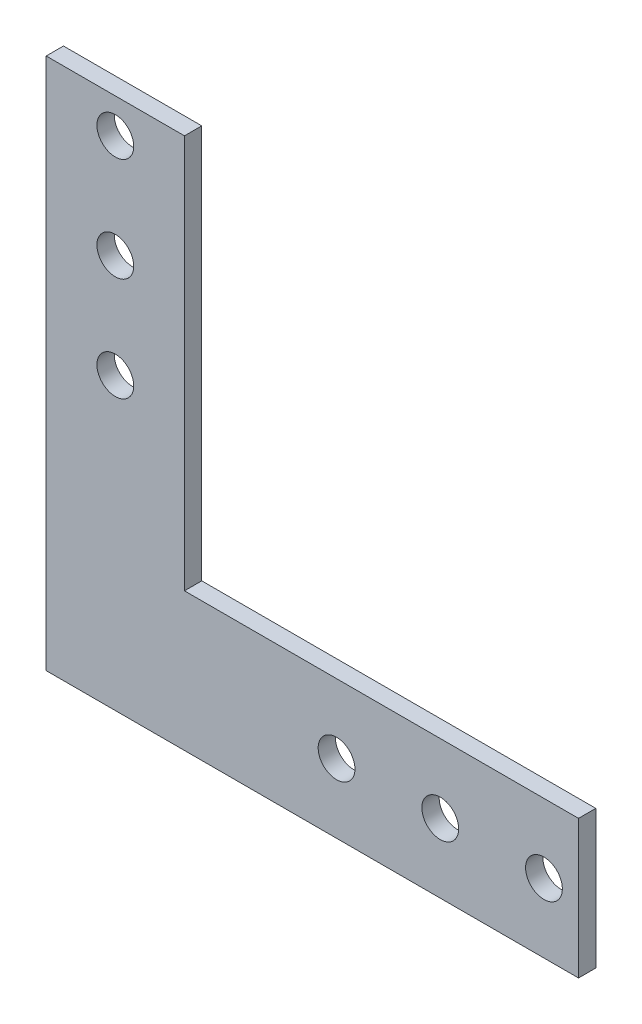
ISO-10303-21;
HEADER;
FILE_DESCRIPTION(('STEP AP214'),'2;1');
FILE_NAME('part.step','',(''),(''),'','','');
FILE_SCHEMA(('AUTOMOTIVE_DESIGN { 1 0 10303 214 1 1 1 1 }'));
ENDSEC;
DATA;
#1=APPLICATION_CONTEXT('core data for automotive mechanical design processes');
#2=APPLICATION_PROTOCOL_DEFINITION('international standard','automotive_design',2000,#1);
#3=PRODUCT_CONTEXT('',#1,'mechanical');
#4=PRODUCT('Part','Part','',(#3));
#5=PRODUCT_RELATED_PRODUCT_CATEGORY('part','',(#4));
#6=PRODUCT_DEFINITION_FORMATION('','',#4);
#7=PRODUCT_DEFINITION_CONTEXT('part definition',#1,'design');
#8=PRODUCT_DEFINITION('design','',#6,#7);
#9=PRODUCT_DEFINITION_SHAPE('','',#8);
#10=(LENGTH_UNIT() NAMED_UNIT(*) SI_UNIT(.MILLI.,.METRE.));
#11=(NAMED_UNIT(*) PLANE_ANGLE_UNIT() SI_UNIT($,.RADIAN.));
#12=(NAMED_UNIT(*) SI_UNIT($,.STERADIAN.) SOLID_ANGLE_UNIT());
#13=UNCERTAINTY_MEASURE_WITH_UNIT(LENGTH_MEASURE(1.E-05),#10,'distance_accuracy_value','');
#14=(GEOMETRIC_REPRESENTATION_CONTEXT(3) GLOBAL_UNCERTAINTY_ASSIGNED_CONTEXT((#13)) GLOBAL_UNIT_ASSIGNED_CONTEXT((#10,
#11,#12)) REPRESENTATION_CONTEXT('',''));
#15=CARTESIAN_POINT('',(0.,0.,0.));
#16=DIRECTION('',(0.,0.,1.));
#17=DIRECTION('',(1.,0.,0.));
#18=AXIS2_PLACEMENT_3D('',#15,#16,#17);
#19=CARTESIAN_POINT('',(0.,25.4,3.175));
#20=DIRECTION('',(0.,1.,0.));
#21=DIRECTION('',(-1.,0.,0.));
#22=AXIS2_PLACEMENT_3D('',#19,#20,#21);
#23=PLANE('',#22);
#24=DIRECTION('',(1.,0.,0.));
#25=VECTOR('',#24,1.);
#26=CARTESIAN_POINT('',(0.,25.4,0.));
#27=LINE('',#26,#25);
#28=CARTESIAN_POINT('',(25.4,25.4,0.));
#29=VERTEX_POINT('',#28);
#30=CARTESIAN_POINT('',(97.79,25.4,0.));
#31=VERTEX_POINT('',#30);
#32=EDGE_CURVE('E117',#29,#31,#27,.T.);
#33=ORIENTED_EDGE('',*,*,#32,.F.);
#34=DIRECTION('',(0.,0.,-1.));
#35=VECTOR('',#34,1.);
#36=CARTESIAN_POINT('',(25.4,25.4,3.175));
#37=LINE('',#36,#35);
#38=CARTESIAN_POINT('',(25.4,25.4,3.175));
#39=VERTEX_POINT('',#38);
#40=EDGE_CURVE('E11',#39,#29,#37,.T.);
#41=ORIENTED_EDGE('',*,*,#40,.F.);
#42=DIRECTION('',(1.,0.,0.));
#43=VECTOR('',#42,1.);
#44=CARTESIAN_POINT('',(0.,25.4,3.175));
#45=LINE('',#44,#43);
#46=CARTESIAN_POINT('',(97.79,25.4,3.175));
#47=VERTEX_POINT('',#46);
#48=EDGE_CURVE('E131',#39,#47,#45,.T.);
#49=ORIENTED_EDGE('',*,*,#48,.T.);
#50=DIRECTION('',(0.,0.,-1.));
#51=VECTOR('',#50,1.);
#52=CARTESIAN_POINT('',(97.79,25.4,3.175));
#53=LINE('',#52,#51);
#54=EDGE_CURVE('E79',#47,#31,#53,.T.);
#55=ORIENTED_EDGE('',*,*,#54,.T.);
#56=EDGE_LOOP('',(#33,#41,#49,#55));
#57=FACE_BOUND('',#56,.T.);
#58=ADVANCED_FACE('F35',(#57),#23,.T.);
#59=CARTESIAN_POINT('',(25.4,0.,3.175));
#60=DIRECTION('',(-1.,0.,0.));
#61=DIRECTION('',(0.,-1.,0.));
#62=AXIS2_PLACEMENT_3D('',#59,#60,#61);
#63=PLANE('',#62);
#64=DIRECTION('',(0.,1.,0.));
#65=VECTOR('',#64,1.);
#66=CARTESIAN_POINT('',(25.4,0.,0.));
#67=LINE('',#66,#65);
#68=CARTESIAN_POINT('',(25.4,97.79,0.));
#69=VERTEX_POINT('',#68);
#70=EDGE_CURVE('E120',#29,#69,#67,.T.);
#71=ORIENTED_EDGE('',*,*,#70,.T.);
#72=DIRECTION('',(0.,0.,-1.));
#73=VECTOR('',#72,1.);
#74=CARTESIAN_POINT('',(25.4,97.79,3.175));
#75=LINE('',#74,#73);
#76=CARTESIAN_POINT('',(25.4,97.79,3.175));
#77=VERTEX_POINT('',#76);
#78=EDGE_CURVE('E43',#77,#69,#75,.T.);
#79=ORIENTED_EDGE('',*,*,#78,.F.);
#80=DIRECTION('',(0.,1.,0.));
#81=VECTOR('',#80,1.);
#82=CARTESIAN_POINT('',(25.4,0.,3.175));
#83=LINE('',#82,#81);
#84=EDGE_CURVE('E112',#39,#77,#83,.T.);
#85=ORIENTED_EDGE('',*,*,#84,.F.);
#86=ORIENTED_EDGE('',*,*,#40,.T.);
#87=EDGE_LOOP('',(#71,#79,#85,#86));
#88=FACE_BOUND('',#87,.T.);
#89=ADVANCED_FACE('F140',(#88),#63,.F.);
#90=CARTESIAN_POINT('',(0.,97.79,3.175));
#91=DIRECTION('',(0.,1.,0.));
#92=DIRECTION('',(0.,0.,1.));
#93=AXIS2_PLACEMENT_3D('',#90,#91,#92);
#94=PLANE('',#93);
#95=DIRECTION('',(1.,0.,0.));
#96=VECTOR('',#95,1.);
#97=CARTESIAN_POINT('',(0.,97.79,0.));
#98=LINE('',#97,#96);
#99=CARTESIAN_POINT('',(0.,97.79,0.));
#100=VERTEX_POINT('',#99);
#101=EDGE_CURVE('E124',#100,#69,#98,.T.);
#102=ORIENTED_EDGE('',*,*,#101,.F.);
#103=DIRECTION('',(0.,0.,-1.));
#104=VECTOR('',#103,1.);
#105=CARTESIAN_POINT('',(0.,97.79,3.175));
#106=LINE('',#105,#104);
#107=CARTESIAN_POINT('',(0.,97.79,3.175));
#108=VERTEX_POINT('',#107);
#109=EDGE_CURVE('E101',#108,#100,#106,.T.);
#110=ORIENTED_EDGE('',*,*,#109,.F.);
#111=DIRECTION('',(1.,0.,0.));
#112=VECTOR('',#111,1.);
#113=CARTESIAN_POINT('',(0.,97.79,3.175));
#114=LINE('',#113,#112);
#115=EDGE_CURVE('E110',#108,#77,#114,.T.);
#116=ORIENTED_EDGE('',*,*,#115,.T.);
#117=ORIENTED_EDGE('',*,*,#78,.T.);
#118=EDGE_LOOP('',(#102,#110,#116,#117));
#119=FACE_BOUND('',#118,.T.);
#120=ADVANCED_FACE('F137',(#119),#94,.T.);
#121=CARTESIAN_POINT('',(0.,0.,3.175));
#122=DIRECTION('',(-1.,0.,0.));
#123=DIRECTION('',(0.,0.,1.));
#124=AXIS2_PLACEMENT_3D('',#121,#122,#123);
#125=PLANE('',#124);
#126=DIRECTION('',(0.,1.,0.));
#127=VECTOR('',#126,1.);
#128=CARTESIAN_POINT('',(0.,0.,0.));
#129=LINE('',#128,#127);
#130=CARTESIAN_POINT('',(0.,0.,0.));
#131=VERTEX_POINT('',#130);
#132=EDGE_CURVE('E100',#131,#100,#129,.T.);
#133=ORIENTED_EDGE('',*,*,#132,.F.);
#134=DIRECTION('',(0.,0.,-1.));
#135=VECTOR('',#134,1.);
#136=CARTESIAN_POINT('',(0.,0.,3.175));
#137=LINE('',#136,#135);
#138=CARTESIAN_POINT('',(0.,0.,3.175));
#139=VERTEX_POINT('',#138);
#140=EDGE_CURVE('E94',#139,#131,#137,.T.);
#141=ORIENTED_EDGE('',*,*,#140,.F.);
#142=DIRECTION('',(0.,1.,0.));
#143=VECTOR('',#142,1.);
#144=CARTESIAN_POINT('',(0.,0.,3.175));
#145=LINE('',#144,#143);
#146=EDGE_CURVE('E98',#139,#108,#145,.T.);
#147=ORIENTED_EDGE('',*,*,#146,.T.);
#148=ORIENTED_EDGE('',*,*,#109,.T.);
#149=EDGE_LOOP('',(#133,#141,#147,#148));
#150=FACE_BOUND('',#149,.T.);
#151=ADVANCED_FACE('F96',(#150),#125,.T.);
#152=CARTESIAN_POINT('',(0.,0.,3.175));
#153=DIRECTION('',(0.,1.,0.));
#154=DIRECTION('',(0.,0.,1.));
#155=AXIS2_PLACEMENT_3D('',#152,#153,#154);
#156=PLANE('',#155);
#157=DIRECTION('',(1.,0.,0.));
#158=VECTOR('',#157,1.);
#159=CARTESIAN_POINT('',(0.,0.,0.));
#160=LINE('',#159,#158);
#161=CARTESIAN_POINT('',(97.79,0.,0.));
#162=VERTEX_POINT('',#161);
#163=EDGE_CURVE('E72',#131,#162,#160,.T.);
#164=ORIENTED_EDGE('',*,*,#163,.T.);
#165=DIRECTION('',(0.,0.,-1.));
#166=VECTOR('',#165,1.);
#167=CARTESIAN_POINT('',(97.79,0.,3.175));
#168=LINE('',#167,#166);
#169=CARTESIAN_POINT('',(97.79,0.,3.175));
#170=VERTEX_POINT('',#169);
#171=EDGE_CURVE('E102',#170,#162,#168,.T.);
#172=ORIENTED_EDGE('',*,*,#171,.F.);
#173=DIRECTION('',(1.,0.,0.));
#174=VECTOR('',#173,1.);
#175=CARTESIAN_POINT('',(0.,0.,3.175));
#176=LINE('',#175,#174);
#177=EDGE_CURVE('E104',#139,#170,#176,.T.);
#178=ORIENTED_EDGE('',*,*,#177,.F.);
#179=ORIENTED_EDGE('',*,*,#140,.T.);
#180=EDGE_LOOP('',(#164,#172,#178,#179));
#181=FACE_BOUND('',#180,.T.);
#182=ADVANCED_FACE('F105',(#181),#156,.F.);
#183=CARTESIAN_POINT('',(97.79,0.,3.175));
#184=DIRECTION('',(-1.,0.,0.));
#185=DIRECTION('',(0.,-1.,0.));
#186=AXIS2_PLACEMENT_3D('',#183,#184,#185);
#187=PLANE('',#186);
#188=DIRECTION('',(0.,1.,0.));
#189=VECTOR('',#188,1.);
#190=CARTESIAN_POINT('',(97.79,0.,0.));
#191=LINE('',#190,#189);
#192=EDGE_CURVE('E129',#162,#31,#191,.T.);
#193=ORIENTED_EDGE('',*,*,#192,.T.);
#194=ORIENTED_EDGE('',*,*,#54,.F.);
#195=DIRECTION('',(0.,1.,0.));
#196=VECTOR('',#195,1.);
#197=CARTESIAN_POINT('',(97.79,0.,3.175));
#198=LINE('',#197,#196);
#199=EDGE_CURVE('E51',#170,#47,#198,.T.);
#200=ORIENTED_EDGE('',*,*,#199,.F.);
#201=ORIENTED_EDGE('',*,*,#171,.T.);
#202=EDGE_LOOP('',(#193,#194,#200,#201));
#203=FACE_BOUND('',#202,.T.);
#204=ADVANCED_FACE('F145',(#203),#187,.F.);
#205=CARTESIAN_POINT('',(0.,0.,3.175));
#206=DIRECTION('',(0.,0.,1.));
#207=DIRECTION('',(1.,0.,0.));
#208=AXIS2_PLACEMENT_3D('',#205,#206,#207);
#209=PLANE('',#208);
#210=CARTESIAN_POINT('',(91.44,12.7,3.175));
#211=DIRECTION('',(0.,0.,1.));
#212=DIRECTION('',(1.,0.,0.));
#213=AXIS2_PLACEMENT_3D('',#210,#211,#212);
#214=CIRCLE('',#213,3.37819999999999);
#215=CARTESIAN_POINT('',(94.8182,12.7,3.175));
#216=VERTEX_POINT('',#215);
#217=EDGE_CURVE('E178',#216,#216,#214,.T.);
#218=ORIENTED_EDGE('',*,*,#217,.F.);
#219=EDGE_LOOP('',(#218));
#220=FACE_BOUND('',#219,.T.);
#221=CARTESIAN_POINT('',(12.7,91.44,3.175));
#222=DIRECTION('',(0.,0.,1.));
#223=DIRECTION('',(1.,0.,0.));
#224=AXIS2_PLACEMENT_3D('',#221,#222,#223);
#225=CIRCLE('',#224,3.3782);
#226=CARTESIAN_POINT('',(16.0782,91.44,3.175));
#227=VERTEX_POINT('',#226);
#228=EDGE_CURVE('E172',#227,#227,#225,.T.);
#229=ORIENTED_EDGE('',*,*,#228,.F.);
#230=EDGE_LOOP('',(#229));
#231=FACE_BOUND('',#230,.T.);
#232=CARTESIAN_POINT('',(12.7,72.39,3.175));
#233=DIRECTION('',(0.,0.,1.));
#234=DIRECTION('',(1.,0.,0.));
#235=AXIS2_PLACEMENT_3D('',#232,#233,#234);
#236=CIRCLE('',#235,3.3782);
#237=CARTESIAN_POINT('',(16.0782,72.39,3.175));
#238=VERTEX_POINT('',#237);
#239=EDGE_CURVE('E166',#238,#238,#236,.T.);
#240=ORIENTED_EDGE('',*,*,#239,.F.);
#241=EDGE_LOOP('',(#240));
#242=FACE_BOUND('',#241,.T.);
#243=CARTESIAN_POINT('',(12.7,53.34,3.175));
#244=DIRECTION('',(0.,0.,1.));
#245=DIRECTION('',(1.,0.,0.));
#246=AXIS2_PLACEMENT_3D('',#243,#244,#245);
#247=CIRCLE('',#246,3.3782);
#248=CARTESIAN_POINT('',(16.0782,53.34,3.175));
#249=VERTEX_POINT('',#248);
#250=EDGE_CURVE('E160',#249,#249,#247,.T.);
#251=ORIENTED_EDGE('',*,*,#250,.F.);
#252=EDGE_LOOP('',(#251));
#253=FACE_BOUND('',#252,.T.);
#254=CARTESIAN_POINT('',(72.39,12.7,3.175));
#255=DIRECTION('',(0.,0.,1.));
#256=DIRECTION('',(1.,0.,0.));
#257=AXIS2_PLACEMENT_3D('',#254,#255,#256);
#258=CIRCLE('',#257,3.37819999999999);
#259=CARTESIAN_POINT('',(75.7682,12.7,3.175));
#260=VERTEX_POINT('',#259);
#261=EDGE_CURVE('E154',#260,#260,#258,.T.);
#262=ORIENTED_EDGE('',*,*,#261,.F.);
#263=EDGE_LOOP('',(#262));
#264=FACE_BOUND('',#263,.T.);
#265=CARTESIAN_POINT('',(53.34,12.7,3.175));
#266=DIRECTION('',(0.,0.,1.));
#267=DIRECTION('',(1.,0.,0.));
#268=AXIS2_PLACEMENT_3D('',#265,#266,#267);
#269=CIRCLE('',#268,3.3782);
#270=CARTESIAN_POINT('',(56.7182,12.7,3.175));
#271=VERTEX_POINT('',#270);
#272=EDGE_CURVE('E148',#271,#271,#269,.T.);
#273=ORIENTED_EDGE('',*,*,#272,.F.);
#274=EDGE_LOOP('',(#273));
#275=FACE_BOUND('',#274,.T.);
#276=ORIENTED_EDGE('',*,*,#48,.F.);
#277=ORIENTED_EDGE('',*,*,#84,.T.);
#278=ORIENTED_EDGE('',*,*,#115,.F.);
#279=ORIENTED_EDGE('',*,*,#146,.F.);
#280=ORIENTED_EDGE('',*,*,#177,.T.);
#281=ORIENTED_EDGE('',*,*,#199,.T.);
#282=EDGE_LOOP('',(#276,#277,#278,#279,#280,#281));
#283=FACE_BOUND('',#282,.T.);
#284=ADVANCED_FACE('F108',(#220,#231,#242,#253,#264,#275,#283),#209,.T.);
#285=CARTESIAN_POINT('',(0.,0.,0.));
#286=DIRECTION('',(0.,0.,1.));
#287=DIRECTION('',(1.,0.,0.));
#288=AXIS2_PLACEMENT_3D('',#285,#286,#287);
#289=PLANE('',#288);
#290=CARTESIAN_POINT('',(91.44,12.7,0.));
#291=DIRECTION('',(0.,0.,1.));
#292=DIRECTION('',(1.,0.,0.));
#293=AXIS2_PLACEMENT_3D('',#290,#291,#292);
#294=CIRCLE('',#293,3.37819999999999);
#295=CARTESIAN_POINT('',(94.8182,12.7,0.));
#296=VERTEX_POINT('',#295);
#297=EDGE_CURVE('E175',#296,#296,#294,.T.);
#298=ORIENTED_EDGE('',*,*,#297,.T.);
#299=EDGE_LOOP('',(#298));
#300=FACE_BOUND('',#299,.T.);
#301=CARTESIAN_POINT('',(12.7,91.44,0.));
#302=DIRECTION('',(0.,0.,1.));
#303=DIRECTION('',(1.,0.,0.));
#304=AXIS2_PLACEMENT_3D('',#301,#302,#303);
#305=CIRCLE('',#304,3.3782);
#306=CARTESIAN_POINT('',(16.0782,91.44,0.));
#307=VERTEX_POINT('',#306);
#308=EDGE_CURVE('E169',#307,#307,#305,.T.);
#309=ORIENTED_EDGE('',*,*,#308,.T.);
#310=EDGE_LOOP('',(#309));
#311=FACE_BOUND('',#310,.T.);
#312=CARTESIAN_POINT('',(12.7,72.39,0.));
#313=DIRECTION('',(0.,0.,1.));
#314=DIRECTION('',(1.,0.,0.));
#315=AXIS2_PLACEMENT_3D('',#312,#313,#314);
#316=CIRCLE('',#315,3.3782);
#317=CARTESIAN_POINT('',(16.0782,72.39,0.));
#318=VERTEX_POINT('',#317);
#319=EDGE_CURVE('E163',#318,#318,#316,.T.);
#320=ORIENTED_EDGE('',*,*,#319,.T.);
#321=EDGE_LOOP('',(#320));
#322=FACE_BOUND('',#321,.T.);
#323=CARTESIAN_POINT('',(12.7,53.34,0.));
#324=DIRECTION('',(0.,0.,1.));
#325=DIRECTION('',(1.,0.,0.));
#326=AXIS2_PLACEMENT_3D('',#323,#324,#325);
#327=CIRCLE('',#326,3.3782);
#328=CARTESIAN_POINT('',(16.0782,53.34,0.));
#329=VERTEX_POINT('',#328);
#330=EDGE_CURVE('E157',#329,#329,#327,.T.);
#331=ORIENTED_EDGE('',*,*,#330,.T.);
#332=EDGE_LOOP('',(#331));
#333=FACE_BOUND('',#332,.T.);
#334=CARTESIAN_POINT('',(72.39,12.7,0.));
#335=DIRECTION('',(0.,0.,1.));
#336=DIRECTION('',(1.,0.,0.));
#337=AXIS2_PLACEMENT_3D('',#334,#335,#336);
#338=CIRCLE('',#337,3.37819999999999);
#339=CARTESIAN_POINT('',(75.7682,12.7,0.));
#340=VERTEX_POINT('',#339);
#341=EDGE_CURVE('E151',#340,#340,#338,.T.);
#342=ORIENTED_EDGE('',*,*,#341,.T.);
#343=EDGE_LOOP('',(#342));
#344=FACE_BOUND('',#343,.T.);
#345=CARTESIAN_POINT('',(53.34,12.7,0.));
#346=DIRECTION('',(0.,0.,1.));
#347=DIRECTION('',(1.,0.,0.));
#348=AXIS2_PLACEMENT_3D('',#345,#346,#347);
#349=CIRCLE('',#348,3.3782);
#350=CARTESIAN_POINT('',(56.7182,12.7,0.));
#351=VERTEX_POINT('',#350);
#352=EDGE_CURVE('E121',#351,#351,#349,.T.);
#353=ORIENTED_EDGE('',*,*,#352,.T.);
#354=EDGE_LOOP('',(#353));
#355=FACE_BOUND('',#354,.T.);
#356=ORIENTED_EDGE('',*,*,#32,.T.);
#357=ORIENTED_EDGE('',*,*,#192,.F.);
#358=ORIENTED_EDGE('',*,*,#163,.F.);
#359=ORIENTED_EDGE('',*,*,#132,.T.);
#360=ORIENTED_EDGE('',*,*,#101,.T.);
#361=ORIENTED_EDGE('',*,*,#70,.F.);
#362=EDGE_LOOP('',(#356,#357,#358,#359,#360,#361));
#363=FACE_BOUND('',#362,.T.);
#364=ADVANCED_FACE('F142',(#300,#311,#322,#333,#344,#355,#363),#289,.F.);
#365=CARTESIAN_POINT('',(53.34,12.7,0.));
#366=DIRECTION('',(0.,0.,1.));
#367=DIRECTION('',(1.,0.,0.));
#368=AXIS2_PLACEMENT_3D('',#365,#366,#367);
#369=CYLINDRICAL_SURFACE('',#368,3.3782);
#370=ORIENTED_EDGE('',*,*,#352,.F.);
#371=EDGE_LOOP('',(#370));
#372=FACE_BOUND('',#371,.T.);
#373=ORIENTED_EDGE('',*,*,#272,.T.);
#374=EDGE_LOOP('',(#373));
#375=FACE_BOUND('',#374,.T.);
#376=ADVANCED_FACE('F206',(#372,#375),#369,.F.);
#377=CARTESIAN_POINT('',(72.39,12.7,0.));
#378=DIRECTION('',(0.,0.,1.));
#379=DIRECTION('',(1.,0.,0.));
#380=AXIS2_PLACEMENT_3D('',#377,#378,#379);
#381=CYLINDRICAL_SURFACE('',#380,3.37819999999999);
#382=ORIENTED_EDGE('',*,*,#341,.F.);
#383=EDGE_LOOP('',(#382));
#384=FACE_BOUND('',#383,.T.);
#385=ORIENTED_EDGE('',*,*,#261,.T.);
#386=EDGE_LOOP('',(#385));
#387=FACE_BOUND('',#386,.T.);
#388=ADVANCED_FACE('F208',(#384,#387),#381,.F.);
#389=CARTESIAN_POINT('',(12.7,53.34,0.));
#390=DIRECTION('',(0.,0.,1.));
#391=DIRECTION('',(1.,0.,0.));
#392=AXIS2_PLACEMENT_3D('',#389,#390,#391);
#393=CYLINDRICAL_SURFACE('',#392,3.3782);
#394=ORIENTED_EDGE('',*,*,#330,.F.);
#395=EDGE_LOOP('',(#394));
#396=FACE_BOUND('',#395,.T.);
#397=ORIENTED_EDGE('',*,*,#250,.T.);
#398=EDGE_LOOP('',(#397));
#399=FACE_BOUND('',#398,.T.);
#400=ADVANCED_FACE('F215',(#396,#399),#393,.F.);
#401=CARTESIAN_POINT('',(12.7,72.39,0.));
#402=DIRECTION('',(0.,0.,1.));
#403=DIRECTION('',(1.,0.,0.));
#404=AXIS2_PLACEMENT_3D('',#401,#402,#403);
#405=CYLINDRICAL_SURFACE('',#404,3.3782);
#406=ORIENTED_EDGE('',*,*,#319,.F.);
#407=EDGE_LOOP('',(#406));
#408=FACE_BOUND('',#407,.T.);
#409=ORIENTED_EDGE('',*,*,#239,.T.);
#410=EDGE_LOOP('',(#409));
#411=FACE_BOUND('',#410,.T.);
#412=ADVANCED_FACE('F265',(#408,#411),#405,.F.);
#413=CARTESIAN_POINT('',(12.7,91.44,0.));
#414=DIRECTION('',(0.,0.,1.));
#415=DIRECTION('',(1.,0.,0.));
#416=AXIS2_PLACEMENT_3D('',#413,#414,#415);
#417=CYLINDRICAL_SURFACE('',#416,3.3782);
#418=ORIENTED_EDGE('',*,*,#308,.F.);
#419=EDGE_LOOP('',(#418));
#420=FACE_BOUND('',#419,.T.);
#421=ORIENTED_EDGE('',*,*,#228,.T.);
#422=EDGE_LOOP('',(#421));
#423=FACE_BOUND('',#422,.T.);
#424=ADVANCED_FACE('F189',(#420,#423),#417,.F.);
#425=CARTESIAN_POINT('',(91.44,12.7,0.));
#426=DIRECTION('',(0.,0.,1.));
#427=DIRECTION('',(1.,0.,0.));
#428=AXIS2_PLACEMENT_3D('',#425,#426,#427);
#429=CYLINDRICAL_SURFACE('',#428,3.37819999999999);
#430=ORIENTED_EDGE('',*,*,#297,.F.);
#431=EDGE_LOOP('',(#430));
#432=FACE_BOUND('',#431,.T.);
#433=ORIENTED_EDGE('',*,*,#217,.T.);
#434=EDGE_LOOP('',(#433));
#435=FACE_BOUND('',#434,.T.);
#436=ADVANCED_FACE('F186',(#432,#435),#429,.F.);
#437=CLOSED_SHELL('',(#58,#89,#120,#151,#182,#204,#284,#364,#376,#388,#400,#412,#424,#436));
#438=MANIFOLD_SOLID_BREP('B2',#437);
#439=ADVANCED_BREP_SHAPE_REPRESENTATION('',(#18,#438),#14);
#440=SHAPE_DEFINITION_REPRESENTATION(#9,#439);
ENDSEC;
END-ISO-10303-21;
